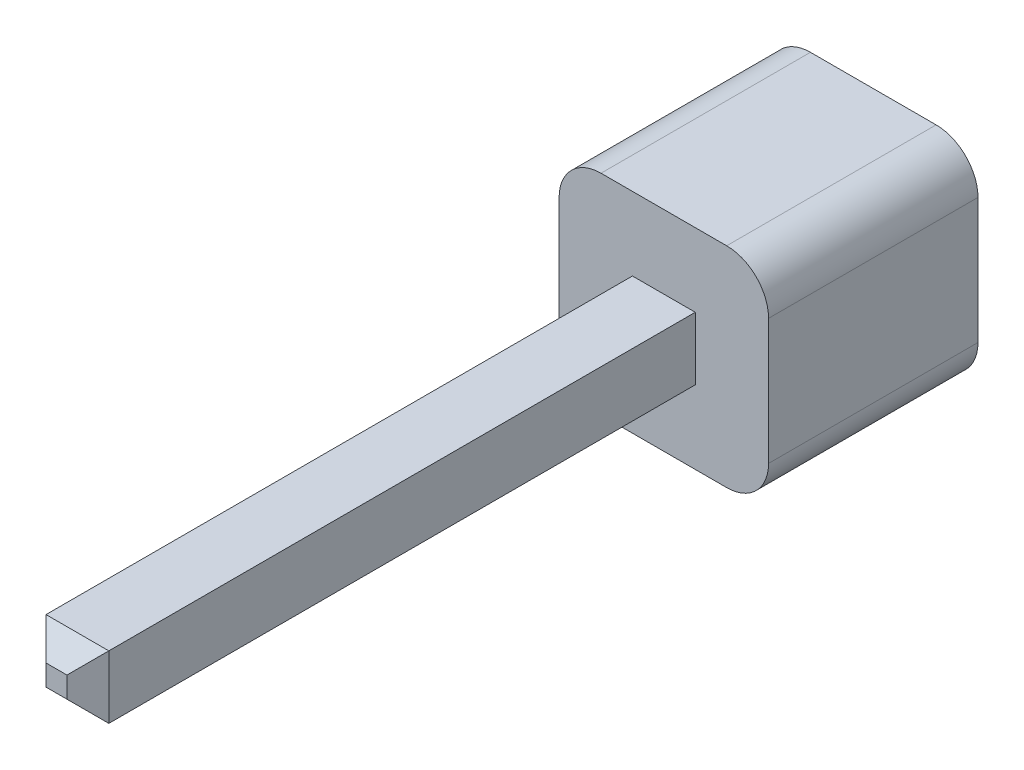
ISO-10303-21;
HEADER;
FILE_DESCRIPTION(('STEP AP214'),'2;1');
FILE_NAME('part.step','',(''),(''),'','','');
FILE_SCHEMA(('AUTOMOTIVE_DESIGN { 1 0 10303 214 1 1 1 1 }'));
ENDSEC;
DATA;
#1=APPLICATION_CONTEXT('core data for automotive mechanical design processes');
#2=APPLICATION_PROTOCOL_DEFINITION('international standard','automotive_design',2000,#1);
#3=PRODUCT_CONTEXT('',#1,'mechanical');
#4=PRODUCT('Part','Part','',(#3));
#5=PRODUCT_RELATED_PRODUCT_CATEGORY('part','',(#4));
#6=PRODUCT_DEFINITION_FORMATION('','',#4);
#7=PRODUCT_DEFINITION_CONTEXT('part definition',#1,'design');
#8=PRODUCT_DEFINITION('design','',#6,#7);
#9=PRODUCT_DEFINITION_SHAPE('','',#8);
#10=(LENGTH_UNIT() NAMED_UNIT(*) SI_UNIT(.MILLI.,.METRE.));
#11=(NAMED_UNIT(*) PLANE_ANGLE_UNIT() SI_UNIT($,.RADIAN.));
#12=(NAMED_UNIT(*) SI_UNIT($,.STERADIAN.) SOLID_ANGLE_UNIT());
#13=UNCERTAINTY_MEASURE_WITH_UNIT(LENGTH_MEASURE(1.E-05),#10,'distance_accuracy_value','');
#14=(GEOMETRIC_REPRESENTATION_CONTEXT(3) GLOBAL_UNCERTAINTY_ASSIGNED_CONTEXT((#13)) GLOBAL_UNIT_ASSIGNED_CONTEXT((#10,
#11,#12)) REPRESENTATION_CONTEXT('',''));
#15=CARTESIAN_POINT('',(0.,0.,0.));
#16=DIRECTION('',(0.,0.,1.));
#17=DIRECTION('',(1.,0.,0.));
#18=AXIS2_PLACEMENT_3D('',#15,#16,#17);
#19=CARTESIAN_POINT('',(0.,0.,0.));
#20=DIRECTION('',(0.,0.,-1.));
#21=DIRECTION('',(-1.,0.,0.));
#22=AXIS2_PLACEMENT_3D('',#19,#20,#21);
#23=PLANE('',#22);
#24=DIRECTION('',(1.,0.,0.));
#25=VECTOR('',#24,1.);
#26=CARTESIAN_POINT('',(0.,0.,0.));
#27=LINE('',#26,#25);
#28=CARTESIAN_POINT('',(0.508,0.,0.));
#29=VERTEX_POINT('',#28);
#30=CARTESIAN_POINT('',(2.032,0.,0.));
#31=VERTEX_POINT('',#30);
#32=EDGE_CURVE('E191',#29,#31,#27,.T.);
#33=ORIENTED_EDGE('',*,*,#32,.T.);
#34=CARTESIAN_POINT('',(2.032,0.508,0.));
#35=DIRECTION('',(0.,0.,-1.));
#36=DIRECTION('',(-1.,0.,0.));
#37=AXIS2_PLACEMENT_3D('',#34,#35,#36);
#38=CIRCLE('',#37,0.508);
#39=CARTESIAN_POINT('',(2.54,0.508,0.));
#40=VERTEX_POINT('',#39);
#41=EDGE_CURVE('E209',#31,#40,#38,.F.);
#42=ORIENTED_EDGE('',*,*,#41,.T.);
#43=DIRECTION('',(0.,1.,0.));
#44=VECTOR('',#43,1.);
#45=CARTESIAN_POINT('',(2.54,0.,0.));
#46=LINE('',#45,#44);
#47=CARTESIAN_POINT('',(2.54,2.032,0.));
#48=VERTEX_POINT('',#47);
#49=EDGE_CURVE('E194',#40,#48,#46,.T.);
#50=ORIENTED_EDGE('',*,*,#49,.T.);
#51=CARTESIAN_POINT('',(2.032,2.032,0.));
#52=DIRECTION('',(0.,0.,-1.));
#53=DIRECTION('',(-1.,0.,0.));
#54=AXIS2_PLACEMENT_3D('',#51,#52,#53);
#55=CIRCLE('',#54,0.508);
#56=CARTESIAN_POINT('',(2.032,2.54,0.));
#57=VERTEX_POINT('',#56);
#58=EDGE_CURVE('E203',#48,#57,#55,.F.);
#59=ORIENTED_EDGE('',*,*,#58,.T.);
#60=DIRECTION('',(-1.,0.,0.));
#61=VECTOR('',#60,1.);
#62=CARTESIAN_POINT('',(0.,2.54,0.));
#63=LINE('',#62,#61);
#64=CARTESIAN_POINT('',(0.508,2.54,0.));
#65=VERTEX_POINT('',#64);
#66=EDGE_CURVE('E179',#57,#65,#63,.T.);
#67=ORIENTED_EDGE('',*,*,#66,.T.);
#68=CARTESIAN_POINT('',(0.508,2.032,0.));
#69=DIRECTION('',(0.,0.,-1.));
#70=DIRECTION('',(-1.,0.,0.));
#71=AXIS2_PLACEMENT_3D('',#68,#69,#70);
#72=CIRCLE('',#71,0.508);
#73=CARTESIAN_POINT('',(0.,2.032,0.));
#74=VERTEX_POINT('',#73);
#75=EDGE_CURVE('E205',#65,#74,#72,.F.);
#76=ORIENTED_EDGE('',*,*,#75,.T.);
#77=DIRECTION('',(0.,-1.,0.));
#78=VECTOR('',#77,1.);
#79=CARTESIAN_POINT('',(0.,0.,0.));
#80=LINE('',#79,#78);
#81=CARTESIAN_POINT('',(0.,0.508,0.));
#82=VERTEX_POINT('',#81);
#83=EDGE_CURVE('E174',#74,#82,#80,.T.);
#84=ORIENTED_EDGE('',*,*,#83,.T.);
#85=CARTESIAN_POINT('',(0.508,0.508,0.));
#86=DIRECTION('',(0.,0.,-1.));
#87=DIRECTION('',(-1.,0.,0.));
#88=AXIS2_PLACEMENT_3D('',#85,#86,#87);
#89=CIRCLE('',#88,0.508);
#90=EDGE_CURVE('E207',#82,#29,#89,.F.);
#91=ORIENTED_EDGE('',*,*,#90,.T.);
#92=EDGE_LOOP('',(#33,#42,#50,#59,#67,#76,#84,#91));
#93=FACE_BOUND('',#92,.T.);
#94=DIRECTION('',(0.,1.,0.));
#95=VECTOR('',#94,1.);
#96=CARTESIAN_POINT('',(1.651,1.27,0.));
#97=LINE('',#96,#95);
#98=CARTESIAN_POINT('',(1.651,0.889,0.));
#99=VERTEX_POINT('',#98);
#100=CARTESIAN_POINT('',(1.651,1.651,0.));
#101=VERTEX_POINT('',#100);
#102=EDGE_CURVE('E159',#99,#101,#97,.T.);
#103=ORIENTED_EDGE('',*,*,#102,.F.);
#104=DIRECTION('',(1.,0.,0.));
#105=VECTOR('',#104,1.);
#106=CARTESIAN_POINT('',(0.889,0.889,0.));
#107=LINE('',#106,#105);
#108=CARTESIAN_POINT('',(0.889,0.889,0.));
#109=VERTEX_POINT('',#108);
#110=EDGE_CURVE('E169',#109,#99,#107,.T.);
#111=ORIENTED_EDGE('',*,*,#110,.F.);
#112=DIRECTION('',(0.,-1.,0.));
#113=VECTOR('',#112,1.);
#114=CARTESIAN_POINT('',(0.889,1.651,0.));
#115=LINE('',#114,#113);
#116=CARTESIAN_POINT('',(0.889,1.651,0.));
#117=VERTEX_POINT('',#116);
#118=EDGE_CURVE('E165',#117,#109,#115,.T.);
#119=ORIENTED_EDGE('',*,*,#118,.F.);
#120=DIRECTION('',(-1.,0.,0.));
#121=VECTOR('',#120,1.);
#122=CARTESIAN_POINT('',(1.651,1.651,0.));
#123=LINE('',#122,#121);
#124=EDGE_CURVE('E254',#101,#117,#123,.T.);
#125=ORIENTED_EDGE('',*,*,#124,.F.);
#126=EDGE_LOOP('',(#103,#111,#119,#125));
#127=FACE_BOUND('',#126,.T.);
#128=ADVANCED_FACE('F33',(#93,#127),#23,.F.);
#129=CARTESIAN_POINT('',(0.,0.,-2.54));
#130=DIRECTION('',(-1.,0.,0.));
#131=DIRECTION('',(0.,0.,1.));
#132=AXIS2_PLACEMENT_3D('',#129,#130,#131);
#133=PLANE('',#132);
#134=DIRECTION('',(0.,-1.,0.));
#135=VECTOR('',#134,1.);
#136=CARTESIAN_POINT('',(0.,0.,-2.54));
#137=LINE('',#136,#135);
#138=CARTESIAN_POINT('',(0.,2.032,-2.54));
#139=VERTEX_POINT('',#138);
#140=CARTESIAN_POINT('',(0.,0.508,-2.54));
#141=VERTEX_POINT('',#140);
#142=EDGE_CURVE('E175',#139,#141,#137,.T.);
#143=ORIENTED_EDGE('',*,*,#142,.T.);
#144=DIRECTION('',(0.,0.,1.));
#145=VECTOR('',#144,1.);
#146=CARTESIAN_POINT('',(0.,0.508,-2.54));
#147=LINE('',#146,#145);
#148=EDGE_CURVE('E226',#141,#82,#147,.T.);
#149=ORIENTED_EDGE('',*,*,#148,.T.);
#150=ORIENTED_EDGE('',*,*,#83,.F.);
#151=DIRECTION('',(0.,0.,1.));
#152=VECTOR('',#151,1.);
#153=CARTESIAN_POINT('',(0.,2.032,-2.54));
#154=LINE('',#153,#152);
#155=EDGE_CURVE('E224',#74,#139,#154,.F.);
#156=ORIENTED_EDGE('',*,*,#155,.T.);
#157=EDGE_LOOP('',(#143,#149,#150,#156));
#158=FACE_BOUND('',#157,.T.);
#159=ADVANCED_FACE('F259',(#158),#133,.T.);
#160=CARTESIAN_POINT('',(0.,2.54,-2.54));
#161=DIRECTION('',(0.,1.,0.));
#162=DIRECTION('',(0.,0.,1.));
#163=AXIS2_PLACEMENT_3D('',#160,#161,#162);
#164=PLANE('',#163);
#165=DIRECTION('',(-1.,0.,0.));
#166=VECTOR('',#165,1.);
#167=CARTESIAN_POINT('',(0.,2.54,-2.54));
#168=LINE('',#167,#166);
#169=CARTESIAN_POINT('',(2.032,2.54,-2.54));
#170=VERTEX_POINT('',#169);
#171=CARTESIAN_POINT('',(0.508,2.54,-2.54));
#172=VERTEX_POINT('',#171);
#173=EDGE_CURVE('E185',#170,#172,#168,.T.);
#174=ORIENTED_EDGE('',*,*,#173,.T.);
#175=DIRECTION('',(0.,0.,1.));
#176=VECTOR('',#175,1.);
#177=CARTESIAN_POINT('',(0.508,2.54,-2.54));
#178=LINE('',#177,#176);
#179=EDGE_CURVE('E231',#172,#65,#178,.T.);
#180=ORIENTED_EDGE('',*,*,#179,.T.);
#181=ORIENTED_EDGE('',*,*,#66,.F.);
#182=DIRECTION('',(0.,0.,1.));
#183=VECTOR('',#182,1.);
#184=CARTESIAN_POINT('',(2.032,2.54,-2.54));
#185=LINE('',#184,#183);
#186=EDGE_CURVE('E229',#57,#170,#185,.F.);
#187=ORIENTED_EDGE('',*,*,#186,.T.);
#188=EDGE_LOOP('',(#174,#180,#181,#187));
#189=FACE_BOUND('',#188,.T.);
#190=ADVANCED_FACE('F265',(#189),#164,.T.);
#191=CARTESIAN_POINT('',(2.54,0.,-2.54));
#192=DIRECTION('',(1.,0.,0.));
#193=DIRECTION('',(0.,0.,-1.));
#194=AXIS2_PLACEMENT_3D('',#191,#192,#193);
#195=PLANE('',#194);
#196=ORIENTED_EDGE('',*,*,#49,.F.);
#197=DIRECTION('',(0.,0.,1.));
#198=VECTOR('',#197,1.);
#199=CARTESIAN_POINT('',(2.54,0.508,-2.54));
#200=LINE('',#199,#198);
#201=CARTESIAN_POINT('',(2.54,0.508,-2.54));
#202=VERTEX_POINT('',#201);
#203=EDGE_CURVE('E214',#40,#202,#200,.F.);
#204=ORIENTED_EDGE('',*,*,#203,.T.);
#205=DIRECTION('',(0.,1.,0.));
#206=VECTOR('',#205,1.);
#207=CARTESIAN_POINT('',(2.54,0.,-2.54));
#208=LINE('',#207,#206);
#209=CARTESIAN_POINT('',(2.54,2.032,-2.54));
#210=VERTEX_POINT('',#209);
#211=EDGE_CURVE('E182',#202,#210,#208,.T.);
#212=ORIENTED_EDGE('',*,*,#211,.T.);
#213=DIRECTION('',(0.,0.,1.));
#214=VECTOR('',#213,1.);
#215=CARTESIAN_POINT('',(2.54,2.032,-2.54));
#216=LINE('',#215,#214);
#217=EDGE_CURVE('E211',#210,#48,#216,.T.);
#218=ORIENTED_EDGE('',*,*,#217,.T.);
#219=EDGE_LOOP('',(#196,#204,#212,#218));
#220=FACE_BOUND('',#219,.T.);
#221=ADVANCED_FACE('F274',(#220),#195,.T.);
#222=CARTESIAN_POINT('',(0.,0.,-2.54));
#223=DIRECTION('',(0.,-1.,0.));
#224=DIRECTION('',(0.,0.,-1.));
#225=AXIS2_PLACEMENT_3D('',#222,#223,#224);
#226=PLANE('',#225);
#227=DIRECTION('',(1.,0.,0.));
#228=VECTOR('',#227,1.);
#229=CARTESIAN_POINT('',(0.,0.,-2.54));
#230=LINE('',#229,#228);
#231=CARTESIAN_POINT('',(0.508,0.,-2.54));
#232=VERTEX_POINT('',#231);
#233=CARTESIAN_POINT('',(2.032,0.,-2.54));
#234=VERTEX_POINT('',#233);
#235=EDGE_CURVE('E178',#232,#234,#230,.T.);
#236=ORIENTED_EDGE('',*,*,#235,.T.);
#237=DIRECTION('',(0.,0.,1.));
#238=VECTOR('',#237,1.);
#239=CARTESIAN_POINT('',(2.032,0.,-2.54));
#240=LINE('',#239,#238);
#241=EDGE_CURVE('E200',#234,#31,#240,.T.);
#242=ORIENTED_EDGE('',*,*,#241,.T.);
#243=ORIENTED_EDGE('',*,*,#32,.F.);
#244=DIRECTION('',(0.,0.,1.));
#245=VECTOR('',#244,1.);
#246=CARTESIAN_POINT('',(0.508,0.,-2.54));
#247=LINE('',#246,#245);
#248=EDGE_CURVE('E188',#29,#232,#247,.F.);
#249=ORIENTED_EDGE('',*,*,#248,.T.);
#250=EDGE_LOOP('',(#236,#242,#243,#249));
#251=FACE_BOUND('',#250,.T.);
#252=ADVANCED_FACE('F278',(#251),#226,.T.);
#253=CARTESIAN_POINT('',(0.,0.,-2.54));
#254=DIRECTION('',(0.,0.,-1.));
#255=DIRECTION('',(-1.,0.,0.));
#256=AXIS2_PLACEMENT_3D('',#253,#254,#255);
#257=PLANE('',#256);
#258=ORIENTED_EDGE('',*,*,#211,.F.);
#259=CARTESIAN_POINT('',(2.032,0.508,-2.54));
#260=DIRECTION('',(0.,0.,-1.));
#261=DIRECTION('',(-1.,0.,0.));
#262=AXIS2_PLACEMENT_3D('',#259,#260,#261);
#263=CIRCLE('',#262,0.508);
#264=EDGE_CURVE('E222',#202,#234,#263,.T.);
#265=ORIENTED_EDGE('',*,*,#264,.T.);
#266=ORIENTED_EDGE('',*,*,#235,.F.);
#267=CARTESIAN_POINT('',(0.508,0.508,-2.54));
#268=DIRECTION('',(0.,0.,-1.));
#269=DIRECTION('',(-1.,0.,0.));
#270=AXIS2_PLACEMENT_3D('',#267,#268,#269);
#271=CIRCLE('',#270,0.508);
#272=EDGE_CURVE('E220',#232,#141,#271,.T.);
#273=ORIENTED_EDGE('',*,*,#272,.T.);
#274=ORIENTED_EDGE('',*,*,#142,.F.);
#275=CARTESIAN_POINT('',(0.508,2.032,-2.54));
#276=DIRECTION('',(0.,0.,-1.));
#277=DIRECTION('',(-1.,0.,0.));
#278=AXIS2_PLACEMENT_3D('',#275,#276,#277);
#279=CIRCLE('',#278,0.508);
#280=EDGE_CURVE('E218',#139,#172,#279,.T.);
#281=ORIENTED_EDGE('',*,*,#280,.T.);
#282=ORIENTED_EDGE('',*,*,#173,.F.);
#283=CARTESIAN_POINT('',(2.032,2.032,-2.54));
#284=DIRECTION('',(0.,0.,-1.));
#285=DIRECTION('',(-1.,0.,0.));
#286=AXIS2_PLACEMENT_3D('',#283,#284,#285);
#287=CIRCLE('',#286,0.508);
#288=EDGE_CURVE('E216',#170,#210,#287,.T.);
#289=ORIENTED_EDGE('',*,*,#288,.T.);
#290=EDGE_LOOP('',(#258,#265,#266,#273,#274,#281,#282,#289));
#291=FACE_BOUND('',#290,.T.);
#292=ADVANCED_FACE('F270',(#291),#257,.T.);
#293=CARTESIAN_POINT('',(2.032,0.508,-2.54));
#294=DIRECTION('',(0.,0.,1.));
#295=DIRECTION('',(1.,0.,0.));
#296=AXIS2_PLACEMENT_3D('',#293,#294,#295);
#297=CYLINDRICAL_SURFACE('',#296,0.508);
#298=ORIENTED_EDGE('',*,*,#264,.F.);
#299=ORIENTED_EDGE('',*,*,#203,.F.);
#300=ORIENTED_EDGE('',*,*,#41,.F.);
#301=ORIENTED_EDGE('',*,*,#241,.F.);
#302=EDGE_LOOP('',(#298,#299,#300,#301));
#303=FACE_BOUND('',#302,.T.);
#304=ADVANCED_FACE('F283',(#303),#297,.T.);
#305=CARTESIAN_POINT('',(0.508,0.508,-2.54));
#306=DIRECTION('',(0.,0.,1.));
#307=DIRECTION('',(1.,0.,0.));
#308=AXIS2_PLACEMENT_3D('',#305,#306,#307);
#309=CYLINDRICAL_SURFACE('',#308,0.508);
#310=ORIENTED_EDGE('',*,*,#272,.F.);
#311=ORIENTED_EDGE('',*,*,#248,.F.);
#312=ORIENTED_EDGE('',*,*,#90,.F.);
#313=ORIENTED_EDGE('',*,*,#148,.F.);
#314=EDGE_LOOP('',(#310,#311,#312,#313));
#315=FACE_BOUND('',#314,.T.);
#316=ADVANCED_FACE('F286',(#315),#309,.T.);
#317=CARTESIAN_POINT('',(0.508,2.032,-2.54));
#318=DIRECTION('',(0.,0.,1.));
#319=DIRECTION('',(1.,0.,0.));
#320=AXIS2_PLACEMENT_3D('',#317,#318,#319);
#321=CYLINDRICAL_SURFACE('',#320,0.508);
#322=ORIENTED_EDGE('',*,*,#280,.F.);
#323=ORIENTED_EDGE('',*,*,#155,.F.);
#324=ORIENTED_EDGE('',*,*,#75,.F.);
#325=ORIENTED_EDGE('',*,*,#179,.F.);
#326=EDGE_LOOP('',(#322,#323,#324,#325));
#327=FACE_BOUND('',#326,.T.);
#328=ADVANCED_FACE('F289',(#327),#321,.T.);
#329=CARTESIAN_POINT('',(2.032,2.032,-2.54));
#330=DIRECTION('',(0.,0.,1.));
#331=DIRECTION('',(1.,0.,0.));
#332=AXIS2_PLACEMENT_3D('',#329,#330,#331);
#333=CYLINDRICAL_SURFACE('',#332,0.508);
#334=ORIENTED_EDGE('',*,*,#288,.F.);
#335=ORIENTED_EDGE('',*,*,#186,.F.);
#336=ORIENTED_EDGE('',*,*,#58,.F.);
#337=ORIENTED_EDGE('',*,*,#217,.F.);
#338=EDGE_LOOP('',(#334,#335,#336,#337));
#339=FACE_BOUND('',#338,.T.);
#340=ADVANCED_FACE('F35',(#339),#333,.T.);
#341=CARTESIAN_POINT('',(1.651,1.27,7.366));
#342=DIRECTION('',(-1.,0.,0.));
#343=DIRECTION('',(0.,0.,1.));
#344=AXIS2_PLACEMENT_3D('',#341,#342,#343);
#345=PLANE('',#344);
#346=DIRECTION('',(0.,0.,-1.));
#347=VECTOR('',#346,1.);
#348=CARTESIAN_POINT('',(1.651,1.651,7.366));
#349=LINE('',#348,#347);
#350=CARTESIAN_POINT('',(1.651,1.651,7.11200000000001));
#351=VERTEX_POINT('',#350);
#352=EDGE_CURVE('E55',#351,#101,#349,.T.);
#353=ORIENTED_EDGE('',*,*,#352,.F.);
#354=DIRECTION('',(0.,-1.,0.));
#355=VECTOR('',#354,1.);
#356=CARTESIAN_POINT('',(1.651,2.54,7.112));
#357=LINE('',#356,#355);
#358=CARTESIAN_POINT('',(1.651,0.889,7.112));
#359=VERTEX_POINT('',#358);
#360=EDGE_CURVE('E251',#351,#359,#357,.T.);
#361=ORIENTED_EDGE('',*,*,#360,.T.);
#362=DIRECTION('',(0.,0.,-1.));
#363=VECTOR('',#362,1.);
#364=CARTESIAN_POINT('',(1.651,0.889,7.366));
#365=LINE('',#364,#363);
#366=EDGE_CURVE('E158',#359,#99,#365,.T.);
#367=ORIENTED_EDGE('',*,*,#366,.T.);
#368=ORIENTED_EDGE('',*,*,#102,.T.);
#369=EDGE_LOOP('',(#353,#361,#367,#368));
#370=FACE_BOUND('',#369,.T.);
#371=ADVANCED_FACE('F250',(#370),#345,.F.);
#372=CARTESIAN_POINT('',(1.651,1.651,7.366));
#373=DIRECTION('',(0.,-1.,0.));
#374=DIRECTION('',(0.,0.,-1.));
#375=AXIS2_PLACEMENT_3D('',#372,#373,#374);
#376=PLANE('',#375);
#377=DIRECTION('',(0.,0.,-1.));
#378=VECTOR('',#377,1.);
#379=CARTESIAN_POINT('',(0.889,1.651,7.366));
#380=LINE('',#379,#378);
#381=CARTESIAN_POINT('',(0.889,1.651,7.11200000000001));
#382=VERTEX_POINT('',#381);
#383=EDGE_CURVE('E166',#382,#117,#380,.T.);
#384=ORIENTED_EDGE('',*,*,#383,.F.);
#385=DIRECTION('',(1.,0.,0.));
#386=VECTOR('',#385,1.);
#387=CARTESIAN_POINT('',(0.,1.651,7.11200000000001));
#388=LINE('',#387,#386);
#389=EDGE_CURVE('E160',#382,#351,#388,.T.);
#390=ORIENTED_EDGE('',*,*,#389,.T.);
#391=ORIENTED_EDGE('',*,*,#352,.T.);
#392=ORIENTED_EDGE('',*,*,#124,.T.);
#393=EDGE_LOOP('',(#384,#390,#391,#392));
#394=FACE_BOUND('',#393,.T.);
#395=ADVANCED_FACE('F244',(#394),#376,.F.);
#396=CARTESIAN_POINT('',(0.889,1.651,7.366));
#397=DIRECTION('',(1.,0.,0.));
#398=DIRECTION('',(0.,1.,0.));
#399=AXIS2_PLACEMENT_3D('',#396,#397,#398);
#400=PLANE('',#399);
#401=DIRECTION('',(0.,0.,-1.));
#402=VECTOR('',#401,1.);
#403=CARTESIAN_POINT('',(0.889,0.889,7.366));
#404=LINE('',#403,#402);
#405=CARTESIAN_POINT('',(0.889,0.889,7.11200000000001));
#406=VERTEX_POINT('',#405);
#407=EDGE_CURVE('E156',#406,#109,#404,.T.);
#408=ORIENTED_EDGE('',*,*,#407,.F.);
#409=DIRECTION('',(0.,-1.,0.));
#410=VECTOR('',#409,1.);
#411=CARTESIAN_POINT('',(0.889,2.54,7.11200000000001));
#412=LINE('',#411,#410);
#413=EDGE_CURVE('E133',#382,#406,#412,.T.);
#414=ORIENTED_EDGE('',*,*,#413,.F.);
#415=ORIENTED_EDGE('',*,*,#383,.T.);
#416=ORIENTED_EDGE('',*,*,#118,.T.);
#417=EDGE_LOOP('',(#408,#414,#415,#416));
#418=FACE_BOUND('',#417,.T.);
#419=ADVANCED_FACE('F163',(#418),#400,.F.);
#420=CARTESIAN_POINT('',(0.889,0.889,7.366));
#421=DIRECTION('',(0.,1.,0.));
#422=DIRECTION('',(0.,0.,1.));
#423=AXIS2_PLACEMENT_3D('',#420,#421,#422);
#424=PLANE('',#423);
#425=ORIENTED_EDGE('',*,*,#366,.F.);
#426=DIRECTION('',(1.,0.,0.));
#427=VECTOR('',#426,1.);
#428=CARTESIAN_POINT('',(0.,0.889,7.11200000000001));
#429=LINE('',#428,#427);
#430=EDGE_CURVE('E147',#406,#359,#429,.T.);
#431=ORIENTED_EDGE('',*,*,#430,.F.);
#432=ORIENTED_EDGE('',*,*,#407,.T.);
#433=ORIENTED_EDGE('',*,*,#110,.T.);
#434=EDGE_LOOP('',(#425,#431,#432,#433));
#435=FACE_BOUND('',#434,.T.);
#436=ADVANCED_FACE('F154',(#435),#424,.F.);
#437=CARTESIAN_POINT('',(0.,0.,7.366));
#438=DIRECTION('',(0.,0.,1.));
#439=DIRECTION('',(1.,0.,0.));
#440=AXIS2_PLACEMENT_3D('',#437,#438,#439);
#441=PLANE('',#440);
#442=DIRECTION('',(0.,-1.,0.));
#443=VECTOR('',#442,1.);
#444=CARTESIAN_POINT('',(1.143,2.54,7.366));
#445=LINE('',#444,#443);
#446=CARTESIAN_POINT('',(1.143,1.397,7.366));
#447=VERTEX_POINT('',#446);
#448=CARTESIAN_POINT('',(1.143,1.143,7.366));
#449=VERTEX_POINT('',#448);
#450=EDGE_CURVE('E48',#447,#449,#445,.T.);
#451=ORIENTED_EDGE('',*,*,#450,.T.);
#452=DIRECTION('',(-1.,0.,0.));
#453=VECTOR('',#452,1.);
#454=CARTESIAN_POINT('',(0.,1.143,7.366));
#455=LINE('',#454,#453);
#456=CARTESIAN_POINT('',(1.397,1.143,7.366));
#457=VERTEX_POINT('',#456);
#458=EDGE_CURVE('E150',#457,#449,#455,.T.);
#459=ORIENTED_EDGE('',*,*,#458,.F.);
#460=DIRECTION('',(0.,-1.,0.));
#461=VECTOR('',#460,1.);
#462=CARTESIAN_POINT('',(1.397,2.54,7.366));
#463=LINE('',#462,#461);
#464=CARTESIAN_POINT('',(1.397,1.397,7.366));
#465=VERTEX_POINT('',#464);
#466=EDGE_CURVE('E151',#465,#457,#463,.T.);
#467=ORIENTED_EDGE('',*,*,#466,.F.);
#468=DIRECTION('',(1.,0.,0.));
#469=VECTOR('',#468,1.);
#470=CARTESIAN_POINT('',(0.,1.397,7.366));
#471=LINE('',#470,#469);
#472=EDGE_CURVE('E235',#447,#465,#471,.T.);
#473=ORIENTED_EDGE('',*,*,#472,.F.);
#474=EDGE_LOOP('',(#451,#459,#467,#473));
#475=FACE_BOUND('',#474,.T.);
#476=ADVANCED_FACE('F378',(#475),#441,.T.);
#477=CARTESIAN_POINT('',(0.,1.143,7.366));
#478=DIRECTION('',(0.,0.707106781186539,-0.707106781186556));
#479=DIRECTION('',(0.,0.707106781186556,0.707106781186539));
#480=AXIS2_PLACEMENT_3D('',#477,#478,#479);
#481=PLANE('',#480);
#482=ORIENTED_EDGE('',*,*,#458,.T.);
#483=DIRECTION('',(-0.57735026918963,-0.577350269189631,-0.577350269189617));
#484=VECTOR('',#483,1.);
#485=CARTESIAN_POINT('',(0.761999999999994,0.761999999999994,6.985));
#486=LINE('',#485,#484);
#487=EDGE_CURVE('E136',#449,#406,#486,.T.);
#488=ORIENTED_EDGE('',*,*,#487,.T.);
#489=ORIENTED_EDGE('',*,*,#430,.T.);
#490=DIRECTION('',(-0.577350269189628,0.577350269189632,0.577350269189617));
#491=VECTOR('',#490,1.);
#492=CARTESIAN_POINT('',(0.93133333333333,1.60866666666667,7.83166666666666));
#493=LINE('',#492,#491);
#494=EDGE_CURVE('E245',#359,#457,#493,.T.);
#495=ORIENTED_EDGE('',*,*,#494,.T.);
#496=EDGE_LOOP('',(#482,#488,#489,#495));
#497=FACE_BOUND('',#496,.T.);
#498=ADVANCED_FACE('F145',(#497),#481,.F.);
#499=CARTESIAN_POINT('',(0.,1.397,7.366));
#500=DIRECTION('',(0.,-0.707106781186539,-0.707106781186556));
#501=DIRECTION('',(0.,0.707106781186556,-0.707106781186539));
#502=AXIS2_PLACEMENT_3D('',#499,#500,#501);
#503=PLANE('',#502);
#504=ORIENTED_EDGE('',*,*,#389,.F.);
#505=DIRECTION('',(0.57735026918963,-0.577350269189631,0.577350269189617));
#506=VECTOR('',#505,1.);
#507=CARTESIAN_POINT('',(0.761999999999994,1.77800000000001,6.985));
#508=LINE('',#507,#506);
#509=EDGE_CURVE('E11',#382,#447,#508,.T.);
#510=ORIENTED_EDGE('',*,*,#509,.T.);
#511=ORIENTED_EDGE('',*,*,#472,.T.);
#512=DIRECTION('',(0.577350269189628,0.577350269189632,-0.577350269189617));
#513=VECTOR('',#512,1.);
#514=CARTESIAN_POINT('',(0.93133333333333,0.931333333333327,7.83166666666666));
#515=LINE('',#514,#513);
#516=EDGE_CURVE('E41',#465,#351,#515,.T.);
#517=ORIENTED_EDGE('',*,*,#516,.T.);
#518=EDGE_LOOP('',(#504,#510,#511,#517));
#519=FACE_BOUND('',#518,.T.);
#520=ADVANCED_FACE('F239',(#519),#503,.F.);
#521=CARTESIAN_POINT('',(1.397,2.54,7.366));
#522=DIRECTION('',(-0.707106781186541,0.,-0.707106781186554));
#523=DIRECTION('',(-0.707106781186554,0.,0.707106781186541));
#524=AXIS2_PLACEMENT_3D('',#521,#522,#523);
#525=PLANE('',#524);
#526=ORIENTED_EDGE('',*,*,#360,.F.);
#527=ORIENTED_EDGE('',*,*,#516,.F.);
#528=ORIENTED_EDGE('',*,*,#466,.T.);
#529=ORIENTED_EDGE('',*,*,#494,.F.);
#530=EDGE_LOOP('',(#526,#527,#528,#529));
#531=FACE_BOUND('',#530,.T.);
#532=ADVANCED_FACE('F404',(#531),#525,.F.);
#533=CARTESIAN_POINT('',(1.143,2.54,7.366));
#534=DIRECTION('',(0.707106781186539,0.,-0.707106781186556));
#535=DIRECTION('',(-0.707106781186556,0.,-0.707106781186539));
#536=AXIS2_PLACEMENT_3D('',#533,#534,#535);
#537=PLANE('',#536);
#538=ORIENTED_EDGE('',*,*,#450,.F.);
#539=ORIENTED_EDGE('',*,*,#509,.F.);
#540=ORIENTED_EDGE('',*,*,#413,.T.);
#541=ORIENTED_EDGE('',*,*,#487,.F.);
#542=EDGE_LOOP('',(#538,#539,#540,#541));
#543=FACE_BOUND('',#542,.T.);
#544=ADVANCED_FACE('F135',(#543),#537,.F.);
#545=CLOSED_SHELL('',(#128,#159,#190,#221,#252,#292,#304,#316,#328,#340,#371,#395,#419,#436,
#476,#498,#520,#532,#544));
#546=MANIFOLD_SOLID_BREP('B2',#545);
#547=ADVANCED_BREP_SHAPE_REPRESENTATION('',(#18,#546),#14);
#548=SHAPE_DEFINITION_REPRESENTATION(#9,#547);
ENDSEC;
END-ISO-10303-21;
